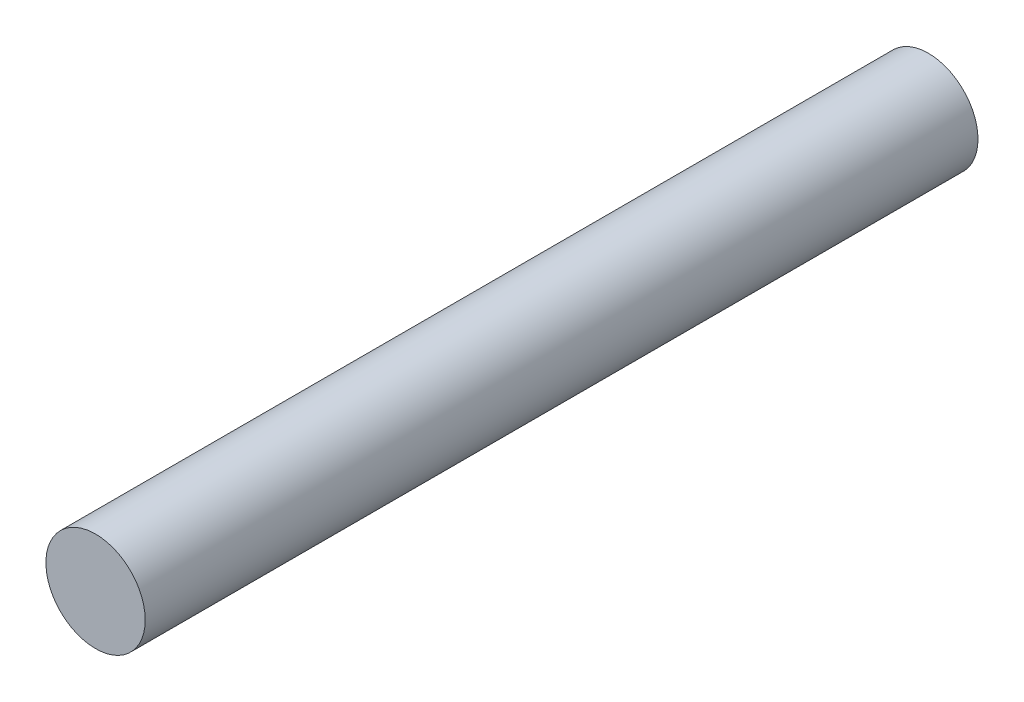
ISO-10303-21;
HEADER;
FILE_DESCRIPTION(('STEP AP214'),'2;1');
FILE_NAME('part.step','',(''),(''),'','','');
FILE_SCHEMA(('AUTOMOTIVE_DESIGN { 1 0 10303 214 1 1 1 1 }'));
ENDSEC;
DATA;
#1=APPLICATION_CONTEXT('core data for automotive mechanical design processes');
#2=APPLICATION_PROTOCOL_DEFINITION('international standard','automotive_design',2000,#1);
#3=PRODUCT_CONTEXT('',#1,'mechanical');
#4=PRODUCT('Part','Part','',(#3));
#5=PRODUCT_RELATED_PRODUCT_CATEGORY('part','',(#4));
#6=PRODUCT_DEFINITION_FORMATION('','',#4);
#7=PRODUCT_DEFINITION_CONTEXT('part definition',#1,'design');
#8=PRODUCT_DEFINITION('design','',#6,#7);
#9=PRODUCT_DEFINITION_SHAPE('','',#8);
#10=(LENGTH_UNIT() NAMED_UNIT(*) SI_UNIT(.MILLI.,.METRE.));
#11=(NAMED_UNIT(*) PLANE_ANGLE_UNIT() SI_UNIT($,.RADIAN.));
#12=(NAMED_UNIT(*) SI_UNIT($,.STERADIAN.) SOLID_ANGLE_UNIT());
#13=UNCERTAINTY_MEASURE_WITH_UNIT(LENGTH_MEASURE(1.E-05),#10,'distance_accuracy_value','');
#14=(GEOMETRIC_REPRESENTATION_CONTEXT(3) GLOBAL_UNCERTAINTY_ASSIGNED_CONTEXT((#13)) GLOBAL_UNIT_ASSIGNED_CONTEXT((#10,
#11,#12)) REPRESENTATION_CONTEXT('',''));
#15=CARTESIAN_POINT('',(0.,0.,0.));
#16=DIRECTION('',(0.,0.,1.));
#17=DIRECTION('',(1.,0.,0.));
#18=AXIS2_PLACEMENT_3D('',#15,#16,#17);
#19=CARTESIAN_POINT('',(0.,0.,26.5));
#20=DIRECTION('',(0.,0.,-1.));
#21=DIRECTION('',(-1.,0.,0.));
#22=AXIS2_PLACEMENT_3D('',#19,#20,#21);
#23=CYLINDRICAL_SURFACE('',#22,1.58);
#24=CARTESIAN_POINT('',(0.,0.,26.5));
#25=DIRECTION('',(0.,0.,1.));
#26=DIRECTION('',(1.,0.,0.));
#27=AXIS2_PLACEMENT_3D('',#24,#25,#26);
#28=CIRCLE('',#27,1.58);
#29=CARTESIAN_POINT('',(1.58,0.,26.5));
#30=VERTEX_POINT('',#29);
#31=EDGE_CURVE('E10',#30,#30,#28,.T.);
#32=ORIENTED_EDGE('',*,*,#31,.F.);
#33=EDGE_LOOP('',(#32));
#34=FACE_BOUND('',#33,.T.);
#35=CARTESIAN_POINT('',(0.,0.,0.));
#36=DIRECTION('',(0.,0.,1.));
#37=DIRECTION('',(1.,0.,0.));
#38=AXIS2_PLACEMENT_3D('',#35,#36,#37);
#39=CIRCLE('',#38,1.58);
#40=CARTESIAN_POINT('',(1.58,0.,0.));
#41=VERTEX_POINT('',#40);
#42=EDGE_CURVE('E46',#41,#41,#39,.T.);
#43=ORIENTED_EDGE('',*,*,#42,.T.);
#44=EDGE_LOOP('',(#43));
#45=FACE_BOUND('',#44,.T.);
#46=ADVANCED_FACE('F43',(#34,#45),#23,.T.);
#47=CARTESIAN_POINT('',(0.,0.,26.5));
#48=DIRECTION('',(0.,0.,1.));
#49=DIRECTION('',(1.,0.,0.));
#50=AXIS2_PLACEMENT_3D('',#47,#48,#49);
#51=PLANE('',#50);
#52=ORIENTED_EDGE('',*,*,#31,.T.);
#53=EDGE_LOOP('',(#52));
#54=FACE_BOUND('',#53,.T.);
#55=ADVANCED_FACE('F60',(#54),#51,.T.);
#56=CARTESIAN_POINT('',(0.,0.,0.));
#57=DIRECTION('',(0.,0.,1.));
#58=DIRECTION('',(1.,0.,0.));
#59=AXIS2_PLACEMENT_3D('',#56,#57,#58);
#60=PLANE('',#59);
#61=ORIENTED_EDGE('',*,*,#42,.F.);
#62=EDGE_LOOP('',(#61));
#63=FACE_BOUND('',#62,.T.);
#64=ADVANCED_FACE('F58',(#63),#60,.F.);
#65=CLOSED_SHELL('',(#46,#55,#64));
#66=MANIFOLD_SOLID_BREP('B2',#65);
#67=ADVANCED_BREP_SHAPE_REPRESENTATION('',(#18,#66),#14);
#68=SHAPE_DEFINITION_REPRESENTATION(#9,#67);
ENDSEC;
END-ISO-10303-21;
